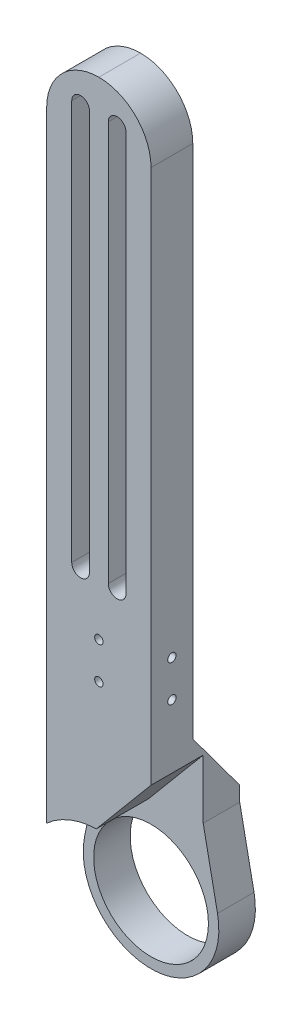
ISO-10303-21;
HEADER;
FILE_DESCRIPTION(('STEP AP214'),'2;1');
FILE_NAME('part.step','',(''),(''),'','','');
FILE_SCHEMA(('AUTOMOTIVE_DESIGN { 1 0 10303 214 1 1 1 1 }'));
ENDSEC;
DATA;
#1=APPLICATION_CONTEXT('core data for automotive mechanical design processes');
#2=APPLICATION_PROTOCOL_DEFINITION('international standard','automotive_design',2000,#1);
#3=PRODUCT_CONTEXT('',#1,'mechanical');
#4=PRODUCT('Part','Part','',(#3));
#5=PRODUCT_RELATED_PRODUCT_CATEGORY('part','',(#4));
#6=PRODUCT_DEFINITION_FORMATION('','',#4);
#7=PRODUCT_DEFINITION_CONTEXT('part definition',#1,'design');
#8=PRODUCT_DEFINITION('design','',#6,#7);
#9=PRODUCT_DEFINITION_SHAPE('','',#8);
#10=(LENGTH_UNIT() NAMED_UNIT(*) SI_UNIT(.MILLI.,.METRE.));
#11=(NAMED_UNIT(*) PLANE_ANGLE_UNIT() SI_UNIT($,.RADIAN.));
#12=(NAMED_UNIT(*) SI_UNIT($,.STERADIAN.) SOLID_ANGLE_UNIT());
#13=UNCERTAINTY_MEASURE_WITH_UNIT(LENGTH_MEASURE(1.E-05),#10,'distance_accuracy_value','');
#14=(GEOMETRIC_REPRESENTATION_CONTEXT(3) GLOBAL_UNCERTAINTY_ASSIGNED_CONTEXT((#13)) GLOBAL_UNIT_ASSIGNED_CONTEXT((#10,
#11,#12)) REPRESENTATION_CONTEXT('',''));
#15=CARTESIAN_POINT('',(0.,0.,0.));
#16=DIRECTION('',(0.,0.,1.));
#17=DIRECTION('',(1.,0.,0.));
#18=AXIS2_PLACEMENT_3D('',#15,#16,#17);
#19=CARTESIAN_POINT('',(9.99999999999999,0.,8.));
#20=DIRECTION('',(1.,0.,0.));
#21=DIRECTION('',(0.,1.,0.));
#22=AXIS2_PLACEMENT_3D('',#19,#20,#21);
#23=PLANE('',#22);
#24=CARTESIAN_POINT('',(9.99999999999999,-23.34,4.));
#25=DIRECTION('',(1.,0.,0.));
#26=DIRECTION('',(0.,0.,-1.));
#27=AXIS2_PLACEMENT_3D('',#24,#25,#26);
#28=CIRCLE('',#27,0.799999999999988);
#29=CARTESIAN_POINT('',(9.99999999999999,-23.34,3.20000000000001));
#30=VERTEX_POINT('',#29);
#31=EDGE_CURVE('E262',#30,#30,#28,.T.);
#32=ORIENTED_EDGE('',*,*,#31,.F.);
#33=EDGE_LOOP('',(#32));
#34=FACE_BOUND('',#33,.T.);
#35=CARTESIAN_POINT('',(9.99999999999999,-30.34,4.));
#36=DIRECTION('',(1.,0.,0.));
#37=DIRECTION('',(0.,0.,-1.));
#38=AXIS2_PLACEMENT_3D('',#35,#36,#37);
#39=CIRCLE('',#38,0.799999999999988);
#40=CARTESIAN_POINT('',(9.99999999999999,-30.34,3.20000000000001));
#41=VERTEX_POINT('',#40);
#42=EDGE_CURVE('E273',#41,#41,#39,.T.);
#43=ORIENTED_EDGE('',*,*,#42,.F.);
#44=EDGE_LOOP('',(#43));
#45=FACE_BOUND('',#44,.T.);
#46=DIRECTION('',(0.,0.,1.));
#47=VECTOR('',#46,1.);
#48=CARTESIAN_POINT('',(10.,-42.5252258054539,-21.370346995577));
#49=LINE('',#48,#47);
#50=CARTESIAN_POINT('',(10.,-42.5252258054539,-2.));
#51=VERTEX_POINT('',#50);
#52=CARTESIAN_POINT('',(10.,-42.5252258054539,8.));
#53=VERTEX_POINT('',#52);
#54=EDGE_CURVE('E90',#51,#53,#49,.T.);
#55=ORIENTED_EDGE('',*,*,#54,.F.);
#56=DIRECTION('',(0.,-1.,0.));
#57=VECTOR('',#56,1.);
#58=CARTESIAN_POINT('',(9.99999999999999,0.,-2.));
#59=LINE('',#58,#57);
#60=CARTESIAN_POINT('',(10.,-53.8445055785966,-2.));
#61=VERTEX_POINT('',#60);
#62=EDGE_CURVE('E476',#51,#61,#59,.T.);
#63=ORIENTED_EDGE('',*,*,#62,.T.);
#64=DIRECTION('',(0.,0.,1.));
#65=VECTOR('',#64,1.);
#66=CARTESIAN_POINT('',(10.,-53.8445055785966,-39.3208061909082));
#67=LINE('',#66,#65);
#68=CARTESIAN_POINT('',(10.,-53.8445055785966,-9.));
#69=VERTEX_POINT('',#68);
#70=EDGE_CURVE('E431',#69,#61,#67,.T.);
#71=ORIENTED_EDGE('',*,*,#70,.F.);
#72=DIRECTION('',(0.,1.,0.));
#73=VECTOR('',#72,1.);
#74=CARTESIAN_POINT('',(10.,-53.8445055785965,-9.));
#75=LINE('',#74,#73);
#76=CARTESIAN_POINT('',(10.,-51.0000000000001,-9.));
#77=VERTEX_POINT('',#76);
#78=EDGE_CURVE('E479',#69,#77,#75,.T.);
#79=ORIENTED_EDGE('',*,*,#78,.T.);
#80=DIRECTION('',(0.,0.803685881428132,0.595053782437425));
#81=VECTOR('',#80,1.);
#82=CARTESIAN_POINT('',(10.,-51.0000000000001,-9.));
#83=LINE('',#82,#81);
#84=CARTESIAN_POINT('',(10.,-38.8445055785965,0.));
#85=VERTEX_POINT('',#84);
#86=EDGE_CURVE('E484',#77,#85,#83,.T.);
#87=ORIENTED_EDGE('',*,*,#86,.T.);
#88=DIRECTION('',(0.,-1.,0.));
#89=VECTOR('',#88,1.);
#90=CARTESIAN_POINT('',(9.99999999999999,0.,0.));
#91=LINE('',#90,#89);
#92=CARTESIAN_POINT('',(9.99999999999998,60.,0.));
#93=VERTEX_POINT('',#92);
#94=EDGE_CURVE('E93',#93,#85,#91,.T.);
#95=ORIENTED_EDGE('',*,*,#94,.F.);
#96=DIRECTION('',(0.,0.,-1.));
#97=VECTOR('',#96,1.);
#98=CARTESIAN_POINT('',(9.99999999999998,60.,8.));
#99=LINE('',#98,#97);
#100=CARTESIAN_POINT('',(9.99999999999998,60.,8.));
#101=VERTEX_POINT('',#100);
#102=EDGE_CURVE('E417',#93,#101,#99,.F.);
#103=ORIENTED_EDGE('',*,*,#102,.T.);
#104=DIRECTION('',(0.,-1.,0.));
#105=VECTOR('',#104,1.);
#106=CARTESIAN_POINT('',(9.99999999999999,0.,8.));
#107=LINE('',#106,#105);
#108=EDGE_CURVE('E340',#101,#53,#107,.T.);
#109=ORIENTED_EDGE('',*,*,#108,.T.);
#110=EDGE_LOOP('',(#55,#63,#71,#79,#87,#95,#103,#109));
#111=FACE_BOUND('',#110,.T.);
#112=ADVANCED_FACE('F71',(#34,#45,#111),#23,.T.);
#113=CARTESIAN_POINT('',(0.,0.,8.));
#114=DIRECTION('',(0.,0.,1.));
#115=DIRECTION('',(1.,0.,0.));
#116=AXIS2_PLACEMENT_3D('',#113,#114,#115);
#117=PLANE('',#116);
#118=CARTESIAN_POINT('',(0.,-23.34,8.));
#119=DIRECTION('',(0.,0.,1.));
#120=DIRECTION('',(1.,0.,0.));
#121=AXIS2_PLACEMENT_3D('',#118,#119,#120);
#122=CIRCLE('',#121,0.799999999999999);
#123=CARTESIAN_POINT('',(0.800000000000007,-23.34,8.));
#124=VERTEX_POINT('',#123);
#125=EDGE_CURVE('E300',#124,#124,#122,.T.);
#126=ORIENTED_EDGE('',*,*,#125,.F.);
#127=EDGE_LOOP('',(#126));
#128=FACE_BOUND('',#127,.T.);
#129=CARTESIAN_POINT('',(0.,-30.34,8.));
#130=DIRECTION('',(0.,0.,1.));
#131=DIRECTION('',(1.,0.,0.));
#132=AXIS2_PLACEMENT_3D('',#129,#130,#131);
#133=CIRCLE('',#132,0.799999999999999);
#134=CARTESIAN_POINT('',(0.800000000000009,-30.34,8.));
#135=VERTEX_POINT('',#134);
#136=EDGE_CURVE('E304',#135,#135,#133,.T.);
#137=ORIENTED_EDGE('',*,*,#136,.F.);
#138=EDGE_LOOP('',(#137));
#139=FACE_BOUND('',#138,.T.);
#140=CARTESIAN_POINT('',(3.49999999999997,63.5,8.));
#141=DIRECTION('',(0.,0.,1.));
#142=DIRECTION('',(1.,0.,0.));
#143=AXIS2_PLACEMENT_3D('',#140,#141,#142);
#144=CIRCLE('',#143,1.70000000000002);
#145=CARTESIAN_POINT('',(5.2,63.5,8.));
#146=VERTEX_POINT('',#145);
#147=CARTESIAN_POINT('',(1.79999999999997,63.5,8.));
#148=VERTEX_POINT('',#147);
#149=EDGE_CURVE('E307',#146,#148,#144,.T.);
#150=ORIENTED_EDGE('',*,*,#149,.F.);
#151=DIRECTION('',(0.,1.,0.));
#152=VECTOR('',#151,1.);
#153=CARTESIAN_POINT('',(5.20000000000002,0.,8.));
#154=LINE('',#153,#152);
#155=CARTESIAN_POINT('',(5.20000000000002,-13.14,8.));
#156=VERTEX_POINT('',#155);
#157=EDGE_CURVE('E308',#156,#146,#154,.T.);
#158=ORIENTED_EDGE('',*,*,#157,.F.);
#159=CARTESIAN_POINT('',(3.5,-13.14,8.));
#160=DIRECTION('',(0.,0.,1.));
#161=DIRECTION('',(1.,0.,0.));
#162=AXIS2_PLACEMENT_3D('',#159,#160,#161);
#163=CIRCLE('',#162,1.70000000000001);
#164=CARTESIAN_POINT('',(1.8,-13.14,8.));
#165=VERTEX_POINT('',#164);
#166=EDGE_CURVE('E314',#165,#156,#163,.T.);
#167=ORIENTED_EDGE('',*,*,#166,.F.);
#168=DIRECTION('',(0.,1.,0.));
#169=VECTOR('',#168,1.);
#170=CARTESIAN_POINT('',(1.79999999999999,0.,8.));
#171=LINE('',#170,#169);
#172=EDGE_CURVE('E316',#165,#148,#171,.T.);
#173=ORIENTED_EDGE('',*,*,#172,.T.);
#174=EDGE_LOOP('',(#150,#158,#167,#173));
#175=FACE_BOUND('',#174,.T.);
#176=CARTESIAN_POINT('',(-3.50000000000003,63.5,8.));
#177=DIRECTION('',(0.,0.,1.));
#178=DIRECTION('',(1.,0.,0.));
#179=AXIS2_PLACEMENT_3D('',#176,#177,#178);
#180=CIRCLE('',#179,1.70000000000002);
#181=CARTESIAN_POINT('',(-1.80000000000001,63.5,8.));
#182=VERTEX_POINT('',#181);
#183=CARTESIAN_POINT('',(-5.20000000000005,63.5,8.));
#184=VERTEX_POINT('',#183);
#185=EDGE_CURVE('E325',#182,#184,#180,.T.);
#186=ORIENTED_EDGE('',*,*,#185,.F.);
#187=DIRECTION('',(0.,1.,0.));
#188=VECTOR('',#187,1.);
#189=CARTESIAN_POINT('',(-1.79999999999999,0.,8.));
#190=LINE('',#189,#188);
#191=CARTESIAN_POINT('',(-1.79999999999998,-13.14,8.));
#192=VERTEX_POINT('',#191);
#193=EDGE_CURVE('E329',#192,#182,#190,.T.);
#194=ORIENTED_EDGE('',*,*,#193,.F.);
#195=CARTESIAN_POINT('',(-3.5,-13.14,8.));
#196=DIRECTION('',(0.,0.,1.));
#197=DIRECTION('',(1.,0.,0.));
#198=AXIS2_PLACEMENT_3D('',#195,#196,#197);
#199=CIRCLE('',#198,1.70000000000001);
#200=CARTESIAN_POINT('',(-5.20000000000001,-13.14,8.));
#201=VERTEX_POINT('',#200);
#202=EDGE_CURVE('E327',#201,#192,#199,.T.);
#203=ORIENTED_EDGE('',*,*,#202,.F.);
#204=DIRECTION('',(0.,1.,0.));
#205=VECTOR('',#204,1.);
#206=CARTESIAN_POINT('',(-5.20000000000002,0.,8.));
#207=LINE('',#206,#205);
#208=EDGE_CURVE('E335',#201,#184,#207,.T.);
#209=ORIENTED_EDGE('',*,*,#208,.T.);
#210=EDGE_LOOP('',(#186,#194,#203,#209));
#211=FACE_BOUND('',#210,.T.);
#212=CARTESIAN_POINT('',(0.,-70.,8.));
#213=DIRECTION('',(0.,0.,1.));
#214=DIRECTION('',(1.,0.,0.));
#215=AXIS2_PLACEMENT_3D('',#212,#213,#214);
#216=CIRCLE('',#215,15.);
#217=CARTESIAN_POINT('',(-0.473860479421247,-55.0074866601346,8.));
#218=VERTEX_POINT('',#217);
#219=CARTESIAN_POINT('',(-9.99999999999999,-58.8196601125011,8.));
#220=VERTEX_POINT('',#219);
#221=EDGE_CURVE('E231',#218,#220,#216,.T.);
#222=ORIENTED_EDGE('',*,*,#221,.F.);
#223=DIRECTION('',(0.64278760968654,0.766044443118977,0.));
#224=VECTOR('',#223,1.);
#225=CARTESIAN_POINT('',(26.8078269242375,-22.4944376847921,8.));
#226=LINE('',#225,#224);
#227=EDGE_CURVE('E216',#218,#53,#226,.T.);
#228=ORIENTED_EDGE('',*,*,#227,.T.);
#229=ORIENTED_EDGE('',*,*,#108,.F.);
#230=CARTESIAN_POINT('',(0.,60.,8.));
#231=DIRECTION('',(0.,0.,1.));
#232=DIRECTION('',(1.,0.,0.));
#233=AXIS2_PLACEMENT_3D('',#230,#231,#232);
#234=CIRCLE('',#233,10.);
#235=CARTESIAN_POINT('',(0.,70.,8.));
#236=VERTEX_POINT('',#235);
#237=EDGE_CURVE('E411',#101,#236,#234,.T.);
#238=ORIENTED_EDGE('',*,*,#237,.T.);
#239=CARTESIAN_POINT('',(0.,60.,8.));
#240=DIRECTION('',(0.,0.,1.));
#241=DIRECTION('',(1.,0.,0.));
#242=AXIS2_PLACEMENT_3D('',#239,#240,#241);
#243=CIRCLE('',#242,10.);
#244=CARTESIAN_POINT('',(-10.,60.,8.));
#245=VERTEX_POINT('',#244);
#246=EDGE_CURVE('E416',#236,#245,#243,.T.);
#247=ORIENTED_EDGE('',*,*,#246,.T.);
#248=DIRECTION('',(0.,-1.,0.));
#249=VECTOR('',#248,1.);
#250=CARTESIAN_POINT('',(-9.99999999999999,0.,8.));
#251=LINE('',#250,#249);
#252=EDGE_CURVE('E242',#245,#220,#251,.T.);
#253=ORIENTED_EDGE('',*,*,#252,.T.);
#254=EDGE_LOOP('',(#222,#228,#229,#238,#247,#253));
#255=FACE_BOUND('',#254,.T.);
#256=ADVANCED_FACE('F238',(#128,#139,#175,#211,#255),#117,.T.);
#257=CARTESIAN_POINT('',(0.,-70.,50.4264068711929));
#258=DIRECTION('',(0.,0.,-1.));
#259=DIRECTION('',(-1.,0.,0.));
#260=AXIS2_PLACEMENT_3D('',#257,#258,#259);
#261=CYLINDRICAL_SURFACE('',#260,15.);
#262=CARTESIAN_POINT('',(0.,-70.,-2.));
#263=DIRECTION('',(0.,0.,1.));
#264=DIRECTION('',(1.,0.,0.));
#265=AXIS2_PLACEMENT_3D('',#262,#263,#264);
#266=CIRCLE('',#265,15.);
#267=CARTESIAN_POINT('',(-0.473860479421247,-55.0074866601346,-2.));
#268=VERTEX_POINT('',#267);
#269=CARTESIAN_POINT('',(-9.99999999999999,-58.8196601125011,-2.));
#270=VERTEX_POINT('',#269);
#271=EDGE_CURVE('E233',#268,#270,#266,.T.);
#272=ORIENTED_EDGE('',*,*,#271,.F.);
#273=DIRECTION('',(0.,0.,1.));
#274=VECTOR('',#273,1.);
#275=CARTESIAN_POINT('',(-0.473860479421247,-55.0074866601346,-21.370346995577));
#276=LINE('',#275,#274);
#277=EDGE_CURVE('E225',#268,#218,#276,.T.);
#278=ORIENTED_EDGE('',*,*,#277,.T.);
#279=ORIENTED_EDGE('',*,*,#221,.T.);
#280=DIRECTION('',(0.,0.,-1.));
#281=VECTOR('',#280,1.);
#282=CARTESIAN_POINT('',(-9.99999999999999,-58.8196601125011,50.4264068711929));
#283=LINE('',#282,#281);
#284=EDGE_CURVE('E244',#220,#270,#283,.T.);
#285=ORIENTED_EDGE('',*,*,#284,.T.);
#286=EDGE_LOOP('',(#272,#278,#279,#285));
#287=FACE_BOUND('',#286,.T.);
#288=ADVANCED_FACE('F232',(#287),#261,.F.);
#289=CARTESIAN_POINT('',(0.839061186172903,-0.169438737034393,-39.3208061909082));
#290=DIRECTION('',(-0.98021356585632,0.197942833442481,0.));
#291=DIRECTION('',(-0.197942833442481,-0.98021356585632,0.));
#292=AXIS2_PLACEMENT_3D('',#289,#290,#291);
#293=PLANE('',#292);
#294=DIRECTION('',(0.197942833442481,0.98021356585632,0.));
#295=VECTOR('',#294,1.);
#296=CARTESIAN_POINT('',(0.839061186172903,-0.169438737034393,-2.));
#297=LINE('',#296,#295);
#298=CARTESIAN_POINT('',(-12.7427763561322,-67.4267431652478,-2.));
#299=VERTEX_POINT('',#298);
#300=CARTESIAN_POINT('',(-9.99999999999999,-53.8445055785965,-2.));
#301=VERTEX_POINT('',#300);
#302=EDGE_CURVE('E12',#299,#301,#297,.T.);
#303=ORIENTED_EDGE('',*,*,#302,.T.);
#304=DIRECTION('',(0.,0.,1.));
#305=VECTOR('',#304,1.);
#306=CARTESIAN_POINT('',(-9.99999999999998,-53.8445055785965,-39.3208061909082));
#307=LINE('',#306,#305);
#308=CARTESIAN_POINT('',(-9.99999999999996,-53.8445055785965,-9.));
#309=VERTEX_POINT('',#308);
#310=EDGE_CURVE('E437',#309,#301,#307,.T.);
#311=ORIENTED_EDGE('',*,*,#310,.F.);
#312=DIRECTION('',(0.197942833442481,0.98021356585632,0.));
#313=VECTOR('',#312,1.);
#314=CARTESIAN_POINT('',(0.839061186172903,-0.169438737034393,-9.));
#315=LINE('',#314,#313);
#316=CARTESIAN_POINT('',(-12.7427763561322,-67.4267431652478,-9.));
#317=VERTEX_POINT('',#316);
#318=EDGE_CURVE('E426',#317,#309,#315,.T.);
#319=ORIENTED_EDGE('',*,*,#318,.F.);
#320=DIRECTION('',(0.,0.,1.));
#321=VECTOR('',#320,1.);
#322=CARTESIAN_POINT('',(-12.7427763561322,-67.4267431652478,-39.3208061909082));
#323=LINE('',#322,#321);
#324=EDGE_CURVE('E445',#317,#299,#323,.T.);
#325=ORIENTED_EDGE('',*,*,#324,.T.);
#326=EDGE_LOOP('',(#303,#311,#319,#325));
#327=FACE_BOUND('',#326,.T.);
#328=ADVANCED_FACE('F530',(#327),#293,.T.);
#329=CARTESIAN_POINT('',(-0.839061186172888,-0.16943873703439,-39.3208061909082));
#330=DIRECTION('',(-0.98021356585632,-0.197942833442481,0.));
#331=DIRECTION('',(0.197942833442481,-0.98021356585632,0.));
#332=AXIS2_PLACEMENT_3D('',#329,#330,#331);
#333=PLANE('',#332);
#334=ORIENTED_EDGE('',*,*,#70,.T.);
#335=DIRECTION('',(-0.197942833442481,0.98021356585632,0.));
#336=VECTOR('',#335,1.);
#337=CARTESIAN_POINT('',(-0.839061186172888,-0.16943873703439,-2.));
#338=LINE('',#337,#336);
#339=CARTESIAN_POINT('',(12.7427763561322,-67.4267431652478,-2.));
#340=VERTEX_POINT('',#339);
#341=EDGE_CURVE('E250',#340,#61,#338,.T.);
#342=ORIENTED_EDGE('',*,*,#341,.F.);
#343=DIRECTION('',(0.,0.,1.));
#344=VECTOR('',#343,1.);
#345=CARTESIAN_POINT('',(12.7427763561322,-67.4267431652478,-39.3208061909082));
#346=LINE('',#345,#344);
#347=CARTESIAN_POINT('',(12.7427763561322,-67.4267431652478,-9.));
#348=VERTEX_POINT('',#347);
#349=EDGE_CURVE('E425',#348,#340,#346,.T.);
#350=ORIENTED_EDGE('',*,*,#349,.F.);
#351=DIRECTION('',(-0.197942833442481,0.98021356585632,0.));
#352=VECTOR('',#351,1.);
#353=CARTESIAN_POINT('',(-0.839061186172888,-0.16943873703439,-9.));
#354=LINE('',#353,#352);
#355=EDGE_CURVE('E429',#348,#69,#354,.T.);
#356=ORIENTED_EDGE('',*,*,#355,.T.);
#357=EDGE_LOOP('',(#334,#342,#350,#356));
#358=FACE_BOUND('',#357,.T.);
#359=ADVANCED_FACE('F468',(#358),#333,.F.);
#360=CARTESIAN_POINT('',(-9.99999999999999,0.,8.));
#361=DIRECTION('',(1.,0.,0.));
#362=DIRECTION('',(0.,1.,0.));
#363=AXIS2_PLACEMENT_3D('',#360,#361,#362);
#364=PLANE('',#363);
#365=DIRECTION('',(0.,-1.,0.));
#366=VECTOR('',#365,1.);
#367=CARTESIAN_POINT('',(-9.99999999999999,0.,0.));
#368=LINE('',#367,#366);
#369=CARTESIAN_POINT('',(-10.,60.,0.));
#370=VERTEX_POINT('',#369);
#371=CARTESIAN_POINT('',(-9.99999999999999,-38.8445055785965,0.));
#372=VERTEX_POINT('',#371);
#373=EDGE_CURVE('E311',#370,#372,#368,.T.);
#374=ORIENTED_EDGE('',*,*,#373,.T.);
#375=DIRECTION('',(0.,-0.803685881428132,-0.595053782437425));
#376=VECTOR('',#375,1.);
#377=CARTESIAN_POINT('',(-9.99999999999999,-51.0000000000001,-9.));
#378=LINE('',#377,#376);
#379=CARTESIAN_POINT('',(-9.99999999999999,-51.0000000000001,-9.));
#380=VERTEX_POINT('',#379);
#381=EDGE_CURVE('E492',#372,#380,#378,.T.);
#382=ORIENTED_EDGE('',*,*,#381,.T.);
#383=DIRECTION('',(0.,-1.,0.));
#384=VECTOR('',#383,1.);
#385=CARTESIAN_POINT('',(-9.99999999999999,-53.8445055785965,-9.));
#386=LINE('',#385,#384);
#387=EDGE_CURVE('E497',#380,#309,#386,.T.);
#388=ORIENTED_EDGE('',*,*,#387,.T.);
#389=ORIENTED_EDGE('',*,*,#310,.T.);
#390=DIRECTION('',(0.,-1.,0.));
#391=VECTOR('',#390,1.);
#392=CARTESIAN_POINT('',(-9.99999999999999,-58.8196601125011,-2.));
#393=LINE('',#392,#391);
#394=EDGE_CURVE('E248',#301,#270,#393,.T.);
#395=ORIENTED_EDGE('',*,*,#394,.T.);
#396=ORIENTED_EDGE('',*,*,#284,.F.);
#397=ORIENTED_EDGE('',*,*,#252,.F.);
#398=DIRECTION('',(0.,0.,-1.));
#399=VECTOR('',#398,1.);
#400=CARTESIAN_POINT('',(-10.,60.,8.));
#401=LINE('',#400,#399);
#402=EDGE_CURVE('E394',#245,#370,#401,.T.);
#403=ORIENTED_EDGE('',*,*,#402,.T.);
#404=EDGE_LOOP('',(#374,#382,#388,#389,#395,#396,#397,#403));
#405=FACE_BOUND('',#404,.T.);
#406=CARTESIAN_POINT('',(-9.99999999999999,-30.34,4.));
#407=DIRECTION('',(-1.,0.,0.));
#408=DIRECTION('',(0.,0.,1.));
#409=AXIS2_PLACEMENT_3D('',#406,#407,#408);
#410=CIRCLE('',#409,0.799999999999988);
#411=CARTESIAN_POINT('',(-9.99999999999999,-30.34,4.79999999999999));
#412=VERTEX_POINT('',#411);
#413=EDGE_CURVE('E288',#412,#412,#410,.T.);
#414=ORIENTED_EDGE('',*,*,#413,.F.);
#415=EDGE_LOOP('',(#414));
#416=FACE_BOUND('',#415,.T.);
#417=CARTESIAN_POINT('',(-9.99999999999999,-23.34,4.));
#418=DIRECTION('',(-1.,0.,0.));
#419=DIRECTION('',(0.,0.,1.));
#420=AXIS2_PLACEMENT_3D('',#417,#418,#419);
#421=CIRCLE('',#420,0.799999999999988);
#422=CARTESIAN_POINT('',(-9.99999999999999,-23.34,4.79999999999999));
#423=VERTEX_POINT('',#422);
#424=EDGE_CURVE('E282',#423,#423,#421,.T.);
#425=ORIENTED_EDGE('',*,*,#424,.F.);
#426=EDGE_LOOP('',(#425));
#427=FACE_BOUND('',#426,.T.);
#428=ADVANCED_FACE('F521',(#405,#416,#427),#364,.F.);
#429=CARTESIAN_POINT('',(0.,-70.,-9.));
#430=DIRECTION('',(0.,0.,1.));
#431=DIRECTION('',(1.,0.,0.));
#432=AXIS2_PLACEMENT_3D('',#429,#430,#431);
#433=CYLINDRICAL_SURFACE('',#432,13.);
#434=ORIENTED_EDGE('',*,*,#324,.F.);
#435=CARTESIAN_POINT('',(0.,-70.,-9.));
#436=DIRECTION('',(0.,0.,1.));
#437=DIRECTION('',(1.,0.,0.));
#438=AXIS2_PLACEMENT_3D('',#435,#436,#437);
#439=CIRCLE('',#438,13.);
#440=EDGE_CURVE('E77',#317,#348,#439,.T.);
#441=ORIENTED_EDGE('',*,*,#440,.T.);
#442=ORIENTED_EDGE('',*,*,#349,.T.);
#443=CARTESIAN_POINT('',(0.,-70.,-2.));
#444=DIRECTION('',(0.,0.,1.));
#445=DIRECTION('',(1.,0.,0.));
#446=AXIS2_PLACEMENT_3D('',#443,#444,#445);
#447=CIRCLE('',#446,13.);
#448=EDGE_CURVE('E451',#299,#340,#447,.T.);
#449=ORIENTED_EDGE('',*,*,#448,.F.);
#450=EDGE_LOOP('',(#434,#441,#442,#449));
#451=FACE_BOUND('',#450,.T.);
#452=ADVANCED_FACE('F72',(#451),#433,.T.);
#453=CARTESIAN_POINT('',(0.,-70.,-9.));
#454=DIRECTION('',(0.,0.,1.));
#455=DIRECTION('',(1.,0.,0.));
#456=AXIS2_PLACEMENT_3D('',#453,#454,#455);
#457=PLANE('',#456);
#458=ORIENTED_EDGE('',*,*,#387,.F.);
#459=DIRECTION('',(-1.,0.,0.));
#460=VECTOR('',#459,1.);
#461=CARTESIAN_POINT('',(27.4928556845359,-51.0000000000001,-9.));
#462=LINE('',#461,#460);
#463=EDGE_CURVE('E481',#77,#380,#462,.T.);
#464=ORIENTED_EDGE('',*,*,#463,.F.);
#465=ORIENTED_EDGE('',*,*,#78,.F.);
#466=ORIENTED_EDGE('',*,*,#355,.F.);
#467=ORIENTED_EDGE('',*,*,#440,.F.);
#468=ORIENTED_EDGE('',*,*,#318,.T.);
#469=EDGE_LOOP('',(#458,#464,#465,#466,#467,#468));
#470=FACE_BOUND('',#469,.T.);
#471=CARTESIAN_POINT('',(0.,-70.,-9.));
#472=DIRECTION('',(0.,0.,1.));
#473=DIRECTION('',(1.,0.,0.));
#474=AXIS2_PLACEMENT_3D('',#471,#472,#473);
#475=CIRCLE('',#474,11.);
#476=CARTESIAN_POINT('',(11.,-70.,-9.));
#477=VERTEX_POINT('',#476);
#478=EDGE_CURVE('E447',#477,#477,#475,.T.);
#479=ORIENTED_EDGE('',*,*,#478,.T.);
#480=EDGE_LOOP('',(#479));
#481=FACE_BOUND('',#480,.T.);
#482=ADVANCED_FACE('F483',(#470,#481),#457,.F.);
#483=CARTESIAN_POINT('',(0.,-70.,-2.));
#484=DIRECTION('',(0.,0.,1.));
#485=DIRECTION('',(1.,0.,0.));
#486=AXIS2_PLACEMENT_3D('',#483,#484,#485);
#487=PLANE('',#486);
#488=DIRECTION('',(-0.64278760968654,-0.766044443118977,0.));
#489=VECTOR('',#488,1.);
#490=CARTESIAN_POINT('',(26.8078269242375,-22.4944376847921,-2.));
#491=LINE('',#490,#489);
#492=EDGE_CURVE('E502',#51,#268,#491,.T.);
#493=ORIENTED_EDGE('',*,*,#492,.T.);
#494=ORIENTED_EDGE('',*,*,#271,.T.);
#495=ORIENTED_EDGE('',*,*,#394,.F.);
#496=ORIENTED_EDGE('',*,*,#302,.F.);
#497=ORIENTED_EDGE('',*,*,#448,.T.);
#498=ORIENTED_EDGE('',*,*,#341,.T.);
#499=ORIENTED_EDGE('',*,*,#62,.F.);
#500=EDGE_LOOP('',(#493,#494,#495,#496,#497,#498,#499));
#501=FACE_BOUND('',#500,.T.);
#502=CARTESIAN_POINT('',(0.,-70.,-2.));
#503=DIRECTION('',(0.,0.,1.));
#504=DIRECTION('',(1.,0.,0.));
#505=AXIS2_PLACEMENT_3D('',#502,#503,#504);
#506=CIRCLE('',#505,11.);
#507=CARTESIAN_POINT('',(11.,-70.,-2.));
#508=VERTEX_POINT('',#507);
#509=EDGE_CURVE('E428',#508,#508,#506,.T.);
#510=ORIENTED_EDGE('',*,*,#509,.F.);
#511=EDGE_LOOP('',(#510));
#512=FACE_BOUND('',#511,.T.);
#513=ADVANCED_FACE('F465',(#501,#512),#487,.T.);
#514=CARTESIAN_POINT('',(0.,-70.,-9.));
#515=DIRECTION('',(0.,0.,1.));
#516=DIRECTION('',(1.,0.,0.));
#517=AXIS2_PLACEMENT_3D('',#514,#515,#516);
#518=CYLINDRICAL_SURFACE('',#517,11.);
#519=ORIENTED_EDGE('',*,*,#478,.F.);
#520=EDGE_LOOP('',(#519));
#521=FACE_BOUND('',#520,.T.);
#522=ORIENTED_EDGE('',*,*,#509,.T.);
#523=EDGE_LOOP('',(#522));
#524=FACE_BOUND('',#523,.T.);
#525=ADVANCED_FACE('F735',(#521,#524),#518,.F.);
#526=CARTESIAN_POINT('',(0.,0.,0.));
#527=DIRECTION('',(0.,0.,1.));
#528=DIRECTION('',(1.,0.,0.));
#529=AXIS2_PLACEMENT_3D('',#526,#527,#528);
#530=PLANE('',#529);
#531=ORIENTED_EDGE('',*,*,#94,.T.);
#532=DIRECTION('',(-1.,0.,0.));
#533=VECTOR('',#532,1.);
#534=CARTESIAN_POINT('',(27.4928556845359,-38.8445055785966,0.));
#535=LINE('',#534,#533);
#536=EDGE_CURVE('E488',#85,#372,#535,.T.);
#537=ORIENTED_EDGE('',*,*,#536,.T.);
#538=ORIENTED_EDGE('',*,*,#373,.F.);
#539=CARTESIAN_POINT('',(0.,60.,0.));
#540=DIRECTION('',(0.,0.,1.));
#541=DIRECTION('',(1.,0.,0.));
#542=AXIS2_PLACEMENT_3D('',#539,#540,#541);
#543=CIRCLE('',#542,10.);
#544=CARTESIAN_POINT('',(0.,70.,0.));
#545=VERTEX_POINT('',#544);
#546=EDGE_CURVE('E409',#370,#545,#543,.F.);
#547=ORIENTED_EDGE('',*,*,#546,.T.);
#548=CARTESIAN_POINT('',(0.,60.,0.));
#549=DIRECTION('',(0.,0.,1.));
#550=DIRECTION('',(1.,0.,0.));
#551=AXIS2_PLACEMENT_3D('',#548,#549,#550);
#552=CIRCLE('',#551,10.);
#553=EDGE_CURVE('E407',#545,#93,#552,.F.);
#554=ORIENTED_EDGE('',*,*,#553,.T.);
#555=EDGE_LOOP('',(#531,#537,#538,#547,#554));
#556=FACE_BOUND('',#555,.T.);
#557=CARTESIAN_POINT('',(-3.50000000000003,63.5,0.));
#558=DIRECTION('',(0.,0.,1.));
#559=DIRECTION('',(1.,0.,0.));
#560=AXIS2_PLACEMENT_3D('',#557,#558,#559);
#561=CIRCLE('',#560,1.70000000000002);
#562=CARTESIAN_POINT('',(-1.80000000000001,63.5,0.));
#563=VERTEX_POINT('',#562);
#564=CARTESIAN_POINT('',(-5.20000000000005,63.5,0.));
#565=VERTEX_POINT('',#564);
#566=EDGE_CURVE('E356',#563,#565,#561,.T.);
#567=ORIENTED_EDGE('',*,*,#566,.T.);
#568=DIRECTION('',(0.,1.,0.));
#569=VECTOR('',#568,1.);
#570=CARTESIAN_POINT('',(-5.20000000000002,0.,0.));
#571=LINE('',#570,#569);
#572=CARTESIAN_POINT('',(-5.20000000000001,-13.14,0.));
#573=VERTEX_POINT('',#572);
#574=EDGE_CURVE('E371',#573,#565,#571,.T.);
#575=ORIENTED_EDGE('',*,*,#574,.F.);
#576=CARTESIAN_POINT('',(-3.5,-13.14,0.));
#577=DIRECTION('',(0.,0.,1.));
#578=DIRECTION('',(1.,0.,0.));
#579=AXIS2_PLACEMENT_3D('',#576,#577,#578);
#580=CIRCLE('',#579,1.70000000000001);
#581=CARTESIAN_POINT('',(-1.79999999999998,-13.14,0.));
#582=VERTEX_POINT('',#581);
#583=EDGE_CURVE('E370',#573,#582,#580,.T.);
#584=ORIENTED_EDGE('',*,*,#583,.T.);
#585=DIRECTION('',(0.,1.,0.));
#586=VECTOR('',#585,1.);
#587=CARTESIAN_POINT('',(-1.79999999999999,0.,0.));
#588=LINE('',#587,#586);
#589=EDGE_CURVE('E362',#582,#563,#588,.T.);
#590=ORIENTED_EDGE('',*,*,#589,.T.);
#591=EDGE_LOOP('',(#567,#575,#584,#590));
#592=FACE_BOUND('',#591,.T.);
#593=CARTESIAN_POINT('',(3.49999999999997,63.5,0.));
#594=DIRECTION('',(0.,0.,1.));
#595=DIRECTION('',(1.,0.,0.));
#596=AXIS2_PLACEMENT_3D('',#593,#594,#595);
#597=CIRCLE('',#596,1.70000000000002);
#598=CARTESIAN_POINT('',(5.2,63.5,0.));
#599=VERTEX_POINT('',#598);
#600=CARTESIAN_POINT('',(1.79999999999997,63.5,0.));
#601=VERTEX_POINT('',#600);
#602=EDGE_CURVE('E343',#599,#601,#597,.T.);
#603=ORIENTED_EDGE('',*,*,#602,.T.);
#604=DIRECTION('',(0.,1.,0.));
#605=VECTOR('',#604,1.);
#606=CARTESIAN_POINT('',(1.79999999999999,0.,0.));
#607=LINE('',#606,#605);
#608=CARTESIAN_POINT('',(1.8,-13.14,0.));
#609=VERTEX_POINT('',#608);
#610=EDGE_CURVE('E354',#609,#601,#607,.T.);
#611=ORIENTED_EDGE('',*,*,#610,.F.);
#612=CARTESIAN_POINT('',(3.5,-13.14,0.));
#613=DIRECTION('',(0.,0.,1.));
#614=DIRECTION('',(1.,0.,0.));
#615=AXIS2_PLACEMENT_3D('',#612,#613,#614);
#616=CIRCLE('',#615,1.70000000000001);
#617=CARTESIAN_POINT('',(5.20000000000002,-13.14,0.));
#618=VERTEX_POINT('',#617);
#619=EDGE_CURVE('E351',#609,#618,#616,.T.);
#620=ORIENTED_EDGE('',*,*,#619,.T.);
#621=DIRECTION('',(0.,1.,0.));
#622=VECTOR('',#621,1.);
#623=CARTESIAN_POINT('',(5.20000000000002,0.,0.));
#624=LINE('',#623,#622);
#625=EDGE_CURVE('E350',#618,#599,#624,.T.);
#626=ORIENTED_EDGE('',*,*,#625,.T.);
#627=EDGE_LOOP('',(#603,#611,#620,#626));
#628=FACE_BOUND('',#627,.T.);
#629=CARTESIAN_POINT('',(0.,-30.34,0.));
#630=DIRECTION('',(0.,0.,-1.));
#631=DIRECTION('',(-1.,0.,0.));
#632=AXIS2_PLACEMENT_3D('',#629,#630,#631);
#633=CIRCLE('',#632,0.799999999999999);
#634=CARTESIAN_POINT('',(-0.799999999999989,-30.34,0.));
#635=VERTEX_POINT('',#634);
#636=EDGE_CURVE('E263',#635,#635,#633,.T.);
#637=ORIENTED_EDGE('',*,*,#636,.F.);
#638=EDGE_LOOP('',(#637));
#639=FACE_BOUND('',#638,.T.);
#640=CARTESIAN_POINT('',(0.,-23.34,0.));
#641=DIRECTION('',(0.,0.,-1.));
#642=DIRECTION('',(-1.,0.,0.));
#643=AXIS2_PLACEMENT_3D('',#640,#641,#642);
#644=CIRCLE('',#643,0.799999999999999);
#645=CARTESIAN_POINT('',(-0.799999999999991,-23.34,0.));
#646=VERTEX_POINT('',#645);
#647=EDGE_CURVE('E257',#646,#646,#644,.T.);
#648=ORIENTED_EDGE('',*,*,#647,.F.);
#649=EDGE_LOOP('',(#648));
#650=FACE_BOUND('',#649,.T.);
#651=ADVANCED_FACE('F573',(#556,#592,#628,#639,#650),#530,.F.);
#652=CARTESIAN_POINT('',(-3.50000000000003,63.5,8.));
#653=DIRECTION('',(0.,0.,-1.));
#654=DIRECTION('',(-1.,0.,0.));
#655=AXIS2_PLACEMENT_3D('',#652,#653,#654);
#656=CYLINDRICAL_SURFACE('',#655,1.70000000000002);
#657=ORIENTED_EDGE('',*,*,#566,.F.);
#658=DIRECTION('',(0.,0.,-1.));
#659=VECTOR('',#658,1.);
#660=CARTESIAN_POINT('',(-1.80000000000001,63.5,8.));
#661=LINE('',#660,#659);
#662=EDGE_CURVE('E389',#182,#563,#661,.T.);
#663=ORIENTED_EDGE('',*,*,#662,.F.);
#664=ORIENTED_EDGE('',*,*,#185,.T.);
#665=DIRECTION('',(0.,0.,-1.));
#666=VECTOR('',#665,1.);
#667=CARTESIAN_POINT('',(-5.20000000000005,63.5,8.));
#668=LINE('',#667,#666);
#669=EDGE_CURVE('E377',#184,#565,#668,.T.);
#670=ORIENTED_EDGE('',*,*,#669,.T.);
#671=EDGE_LOOP('',(#657,#663,#664,#670));
#672=FACE_BOUND('',#671,.T.);
#673=ADVANCED_FACE('F567',(#672),#656,.F.);
#674=CARTESIAN_POINT('',(-1.79999999999999,0.,8.));
#675=DIRECTION('',(-1.,0.,0.));
#676=DIRECTION('',(0.,-1.,0.));
#677=AXIS2_PLACEMENT_3D('',#674,#675,#676);
#678=PLANE('',#677);
#679=ORIENTED_EDGE('',*,*,#589,.F.);
#680=DIRECTION('',(0.,0.,-1.));
#681=VECTOR('',#680,1.);
#682=CARTESIAN_POINT('',(-1.79999999999998,-13.14,8.));
#683=LINE('',#682,#681);
#684=EDGE_CURVE('E390',#192,#582,#683,.T.);
#685=ORIENTED_EDGE('',*,*,#684,.F.);
#686=ORIENTED_EDGE('',*,*,#193,.T.);
#687=ORIENTED_EDGE('',*,*,#662,.T.);
#688=EDGE_LOOP('',(#679,#685,#686,#687));
#689=FACE_BOUND('',#688,.T.);
#690=ADVANCED_FACE('F562',(#689),#678,.T.);
#691=CARTESIAN_POINT('',(-3.5,-13.14,8.));
#692=DIRECTION('',(0.,0.,-1.));
#693=DIRECTION('',(-1.,0.,0.));
#694=AXIS2_PLACEMENT_3D('',#691,#692,#693);
#695=CYLINDRICAL_SURFACE('',#694,1.70000000000001);
#696=ORIENTED_EDGE('',*,*,#583,.F.);
#697=DIRECTION('',(0.,0.,-1.));
#698=VECTOR('',#697,1.);
#699=CARTESIAN_POINT('',(-5.20000000000001,-13.14,8.));
#700=LINE('',#699,#698);
#701=EDGE_CURVE('E381',#201,#573,#700,.T.);
#702=ORIENTED_EDGE('',*,*,#701,.F.);
#703=ORIENTED_EDGE('',*,*,#202,.T.);
#704=ORIENTED_EDGE('',*,*,#684,.T.);
#705=EDGE_LOOP('',(#696,#702,#703,#704));
#706=FACE_BOUND('',#705,.T.);
#707=ADVANCED_FACE('F563',(#706),#695,.F.);
#708=CARTESIAN_POINT('',(3.49999999999997,63.5,8.));
#709=DIRECTION('',(0.,0.,-1.));
#710=DIRECTION('',(-1.,0.,0.));
#711=AXIS2_PLACEMENT_3D('',#708,#709,#710);
#712=CYLINDRICAL_SURFACE('',#711,1.70000000000002);
#713=ORIENTED_EDGE('',*,*,#602,.F.);
#714=DIRECTION('',(0.,0.,-1.));
#715=VECTOR('',#714,1.);
#716=CARTESIAN_POINT('',(5.2,63.5,8.));
#717=LINE('',#716,#715);
#718=EDGE_CURVE('E384',#146,#599,#717,.T.);
#719=ORIENTED_EDGE('',*,*,#718,.F.);
#720=ORIENTED_EDGE('',*,*,#149,.T.);
#721=DIRECTION('',(0.,0.,-1.));
#722=VECTOR('',#721,1.);
#723=CARTESIAN_POINT('',(1.79999999999997,63.5,8.));
#724=LINE('',#723,#722);
#725=EDGE_CURVE('E345',#148,#601,#724,.T.);
#726=ORIENTED_EDGE('',*,*,#725,.T.);
#727=EDGE_LOOP('',(#713,#719,#720,#726));
#728=FACE_BOUND('',#727,.T.);
#729=ADVANCED_FACE('F564',(#728),#712,.F.);
#730=CARTESIAN_POINT('',(5.20000000000002,0.,8.));
#731=DIRECTION('',(-1.,0.,0.));
#732=DIRECTION('',(0.,-1.,0.));
#733=AXIS2_PLACEMENT_3D('',#730,#731,#732);
#734=PLANE('',#733);
#735=ORIENTED_EDGE('',*,*,#625,.F.);
#736=DIRECTION('',(0.,0.,-1.));
#737=VECTOR('',#736,1.);
#738=CARTESIAN_POINT('',(5.20000000000002,-13.14,8.));
#739=LINE('',#738,#737);
#740=EDGE_CURVE('E398',#156,#618,#739,.T.);
#741=ORIENTED_EDGE('',*,*,#740,.F.);
#742=ORIENTED_EDGE('',*,*,#157,.T.);
#743=ORIENTED_EDGE('',*,*,#718,.T.);
#744=EDGE_LOOP('',(#735,#741,#742,#743));
#745=FACE_BOUND('',#744,.T.);
#746=ADVANCED_FACE('F579',(#745),#734,.T.);
#747=CARTESIAN_POINT('',(3.5,-13.14,8.));
#748=DIRECTION('',(0.,0.,-1.));
#749=DIRECTION('',(-1.,0.,0.));
#750=AXIS2_PLACEMENT_3D('',#747,#748,#749);
#751=CYLINDRICAL_SURFACE('',#750,1.70000000000001);
#752=ORIENTED_EDGE('',*,*,#619,.F.);
#753=DIRECTION('',(0.,0.,-1.));
#754=VECTOR('',#753,1.);
#755=CARTESIAN_POINT('',(1.8,-13.14,8.));
#756=LINE('',#755,#754);
#757=EDGE_CURVE('E396',#165,#609,#756,.T.);
#758=ORIENTED_EDGE('',*,*,#757,.F.);
#759=ORIENTED_EDGE('',*,*,#166,.T.);
#760=ORIENTED_EDGE('',*,*,#740,.T.);
#761=EDGE_LOOP('',(#752,#758,#759,#760));
#762=FACE_BOUND('',#761,.T.);
#763=ADVANCED_FACE('F560',(#762),#751,.F.);
#764=CARTESIAN_POINT('',(-5.20000000000002,0.,8.));
#765=DIRECTION('',(-1.,0.,0.));
#766=DIRECTION('',(0.,-1.,0.));
#767=AXIS2_PLACEMENT_3D('',#764,#765,#766);
#768=PLANE('',#767);
#769=ORIENTED_EDGE('',*,*,#574,.T.);
#770=ORIENTED_EDGE('',*,*,#669,.F.);
#771=ORIENTED_EDGE('',*,*,#208,.F.);
#772=ORIENTED_EDGE('',*,*,#701,.T.);
#773=EDGE_LOOP('',(#769,#770,#771,#772));
#774=FACE_BOUND('',#773,.T.);
#775=ADVANCED_FACE('F552',(#774),#768,.F.);
#776=CARTESIAN_POINT('',(1.79999999999999,0.,8.));
#777=DIRECTION('',(-1.,0.,0.));
#778=DIRECTION('',(0.,-1.,0.));
#779=AXIS2_PLACEMENT_3D('',#776,#777,#778);
#780=PLANE('',#779);
#781=ORIENTED_EDGE('',*,*,#610,.T.);
#782=ORIENTED_EDGE('',*,*,#725,.F.);
#783=ORIENTED_EDGE('',*,*,#172,.F.);
#784=ORIENTED_EDGE('',*,*,#757,.T.);
#785=EDGE_LOOP('',(#781,#782,#783,#784));
#786=FACE_BOUND('',#785,.T.);
#787=ADVANCED_FACE('F556',(#786),#780,.F.);
#788=CARTESIAN_POINT('',(0.,60.,8.));
#789=DIRECTION('',(0.,0.,1.));
#790=DIRECTION('',(1.,0.,0.));
#791=AXIS2_PLACEMENT_3D('',#788,#789,#790);
#792=CYLINDRICAL_SURFACE('',#791,10.);
#793=DIRECTION('',(0.,0.,-1.));
#794=VECTOR('',#793,1.);
#795=CARTESIAN_POINT('',(0.,70.,0.));
#796=LINE('',#795,#794);
#797=EDGE_CURVE('E302',#236,#545,#796,.T.);
#798=ORIENTED_EDGE('',*,*,#797,.F.);
#799=ORIENTED_EDGE('',*,*,#237,.F.);
#800=ORIENTED_EDGE('',*,*,#102,.F.);
#801=ORIENTED_EDGE('',*,*,#553,.F.);
#802=EDGE_LOOP('',(#798,#799,#800,#801));
#803=FACE_BOUND('',#802,.T.);
#804=ADVANCED_FACE('F514',(#803),#792,.T.);
#805=CARTESIAN_POINT('',(0.,60.,8.));
#806=DIRECTION('',(0.,0.,-1.));
#807=DIRECTION('',(-1.,0.,0.));
#808=AXIS2_PLACEMENT_3D('',#805,#806,#807);
#809=CYLINDRICAL_SURFACE('',#808,10.);
#810=ORIENTED_EDGE('',*,*,#246,.F.);
#811=ORIENTED_EDGE('',*,*,#797,.T.);
#812=ORIENTED_EDGE('',*,*,#546,.F.);
#813=ORIENTED_EDGE('',*,*,#402,.F.);
#814=EDGE_LOOP('',(#810,#811,#812,#813));
#815=FACE_BOUND('',#814,.T.);
#816=ADVANCED_FACE('F518',(#815),#809,.T.);
#817=CARTESIAN_POINT('',(0.,-30.34,8.));
#818=DIRECTION('',(0.,0.,1.));
#819=DIRECTION('',(1.,0.,0.));
#820=AXIS2_PLACEMENT_3D('',#817,#818,#819);
#821=CYLINDRICAL_SURFACE('',#820,0.799999999999999);
#822=ORIENTED_EDGE('',*,*,#136,.T.);
#823=EDGE_LOOP('',(#822));
#824=FACE_BOUND('',#823,.T.);
#825=ORIENTED_EDGE('',*,*,#636,.T.);
#826=EDGE_LOOP('',(#825));
#827=FACE_BOUND('',#826,.T.);
#828=ADVANCED_FACE('F589',(#824,#827),#821,.F.);
#829=CARTESIAN_POINT('',(0.,-23.34,8.));
#830=DIRECTION('',(0.,0.,1.));
#831=DIRECTION('',(1.,0.,0.));
#832=AXIS2_PLACEMENT_3D('',#829,#830,#831);
#833=CYLINDRICAL_SURFACE('',#832,0.799999999999999);
#834=ORIENTED_EDGE('',*,*,#125,.T.);
#835=EDGE_LOOP('',(#834));
#836=FACE_BOUND('',#835,.T.);
#837=ORIENTED_EDGE('',*,*,#647,.T.);
#838=EDGE_LOOP('',(#837));
#839=FACE_BOUND('',#838,.T.);
#840=ADVANCED_FACE('F606',(#836,#839),#833,.F.);
#841=CARTESIAN_POINT('',(-4.8,-30.34,4.));
#842=DIRECTION('',(-1.,0.,0.));
#843=DIRECTION('',(0.,0.,1.));
#844=AXIS2_PLACEMENT_3D('',#841,#842,#843);
#845=CONICAL_SURFACE('',#844,0.799999999999988,1.02974425867664);
#846=CARTESIAN_POINT('',(-4.31931150477794,-30.34,4.));
#847=VERTEX_POINT('',#846);
#848=VERTEX_LOOP('',#847);
#849=FACE_BOUND('',#848,.T.);
#850=CARTESIAN_POINT('',(-4.8,-30.34,4.));
#851=DIRECTION('',(-1.,0.,0.));
#852=DIRECTION('',(0.,0.,1.));
#853=AXIS2_PLACEMENT_3D('',#850,#851,#852);
#854=CIRCLE('',#853,0.799999999999988);
#855=CARTESIAN_POINT('',(-4.8,-30.34,4.79999999999999));
#856=VERTEX_POINT('',#855);
#857=EDGE_CURVE('E294',#856,#856,#854,.T.);
#858=ORIENTED_EDGE('',*,*,#857,.T.);
#859=EDGE_LOOP('',(#858));
#860=FACE_BOUND('',#859,.T.);
#861=ADVANCED_FACE('F621',(#849,#860),#845,.F.);
#862=CARTESIAN_POINT('',(-9.99999999999999,-30.34,4.));
#863=DIRECTION('',(-1.,0.,0.));
#864=DIRECTION('',(0.,0.,1.));
#865=AXIS2_PLACEMENT_3D('',#862,#863,#864);
#866=CYLINDRICAL_SURFACE('',#865,0.799999999999988);
#867=ORIENTED_EDGE('',*,*,#857,.F.);
#868=EDGE_LOOP('',(#867));
#869=FACE_BOUND('',#868,.T.);
#870=ORIENTED_EDGE('',*,*,#413,.T.);
#871=EDGE_LOOP('',(#870));
#872=FACE_BOUND('',#871,.T.);
#873=ADVANCED_FACE('F633',(#869,#872),#866,.F.);
#874=CARTESIAN_POINT('',(-4.8,-23.34,4.));
#875=DIRECTION('',(-1.,0.,0.));
#876=DIRECTION('',(0.,0.,1.));
#877=AXIS2_PLACEMENT_3D('',#874,#875,#876);
#878=CONICAL_SURFACE('',#877,0.799999999999988,1.02974425867664);
#879=CARTESIAN_POINT('',(-4.31931150477794,-23.34,4.));
#880=VERTEX_POINT('',#879);
#881=VERTEX_LOOP('',#880);
#882=FACE_BOUND('',#881,.T.);
#883=CARTESIAN_POINT('',(-4.8,-23.34,4.));
#884=DIRECTION('',(-1.,0.,0.));
#885=DIRECTION('',(0.,0.,1.));
#886=AXIS2_PLACEMENT_3D('',#883,#884,#885);
#887=CIRCLE('',#886,0.799999999999988);
#888=CARTESIAN_POINT('',(-4.8,-23.34,4.79999999999999));
#889=VERTEX_POINT('',#888);
#890=EDGE_CURVE('E283',#889,#889,#887,.T.);
#891=ORIENTED_EDGE('',*,*,#890,.T.);
#892=EDGE_LOOP('',(#891));
#893=FACE_BOUND('',#892,.T.);
#894=ADVANCED_FACE('F637',(#882,#893),#878,.F.);
#895=CARTESIAN_POINT('',(-9.99999999999999,-23.34,4.));
#896=DIRECTION('',(-1.,0.,0.));
#897=DIRECTION('',(0.,0.,1.));
#898=AXIS2_PLACEMENT_3D('',#895,#896,#897);
#899=CYLINDRICAL_SURFACE('',#898,0.799999999999988);
#900=ORIENTED_EDGE('',*,*,#890,.F.);
#901=EDGE_LOOP('',(#900));
#902=FACE_BOUND('',#901,.T.);
#903=ORIENTED_EDGE('',*,*,#424,.T.);
#904=EDGE_LOOP('',(#903));
#905=FACE_BOUND('',#904,.T.);
#906=ADVANCED_FACE('F649',(#902,#905),#899,.F.);
#907=CARTESIAN_POINT('',(4.8,-30.34,4.));
#908=DIRECTION('',(1.,0.,0.));
#909=DIRECTION('',(0.,0.,-1.));
#910=AXIS2_PLACEMENT_3D('',#907,#908,#909);
#911=CONICAL_SURFACE('',#910,0.799999999999988,1.02974425867664);
#912=CARTESIAN_POINT('',(4.31931150477794,-30.34,4.));
#913=VERTEX_POINT('',#912);
#914=VERTEX_LOOP('',#913);
#915=FACE_BOUND('',#914,.T.);
#916=CARTESIAN_POINT('',(4.8,-30.34,4.));
#917=DIRECTION('',(1.,0.,0.));
#918=DIRECTION('',(0.,0.,-1.));
#919=AXIS2_PLACEMENT_3D('',#916,#917,#918);
#920=CIRCLE('',#919,0.799999999999988);
#921=CARTESIAN_POINT('',(4.8,-30.34,3.20000000000001));
#922=VERTEX_POINT('',#921);
#923=EDGE_CURVE('E280',#922,#922,#920,.T.);
#924=ORIENTED_EDGE('',*,*,#923,.T.);
#925=EDGE_LOOP('',(#924));
#926=FACE_BOUND('',#925,.T.);
#927=ADVANCED_FACE('F658',(#915,#926),#911,.F.);
#928=CARTESIAN_POINT('',(9.99999999999999,-30.34,4.));
#929=DIRECTION('',(1.,0.,0.));
#930=DIRECTION('',(0.,0.,-1.));
#931=AXIS2_PLACEMENT_3D('',#928,#929,#930);
#932=CYLINDRICAL_SURFACE('',#931,0.799999999999988);
#933=ORIENTED_EDGE('',*,*,#923,.F.);
#934=EDGE_LOOP('',(#933));
#935=FACE_BOUND('',#934,.T.);
#936=ORIENTED_EDGE('',*,*,#42,.T.);
#937=EDGE_LOOP('',(#936));
#938=FACE_BOUND('',#937,.T.);
#939=ADVANCED_FACE('F675',(#935,#938),#932,.F.);
#940=CARTESIAN_POINT('',(4.8,-23.34,4.));
#941=DIRECTION('',(1.,0.,0.));
#942=DIRECTION('',(0.,0.,-1.));
#943=AXIS2_PLACEMENT_3D('',#940,#941,#942);
#944=CONICAL_SURFACE('',#943,0.799999999999988,1.02974425867664);
#945=CARTESIAN_POINT('',(4.31931150477794,-23.34,4.));
#946=VERTEX_POINT('',#945);
#947=VERTEX_LOOP('',#946);
#948=FACE_BOUND('',#947,.T.);
#949=CARTESIAN_POINT('',(4.8,-23.34,4.));
#950=DIRECTION('',(1.,0.,0.));
#951=DIRECTION('',(0.,0.,-1.));
#952=AXIS2_PLACEMENT_3D('',#949,#950,#951);
#953=CIRCLE('',#952,0.799999999999988);
#954=CARTESIAN_POINT('',(4.8,-23.34,3.20000000000001));
#955=VERTEX_POINT('',#954);
#956=EDGE_CURVE('E267',#955,#955,#953,.T.);
#957=ORIENTED_EDGE('',*,*,#956,.T.);
#958=EDGE_LOOP('',(#957));
#959=FACE_BOUND('',#958,.T.);
#960=ADVANCED_FACE('F682',(#948,#959),#944,.F.);
#961=CARTESIAN_POINT('',(9.99999999999999,-23.34,4.));
#962=DIRECTION('',(1.,0.,0.));
#963=DIRECTION('',(0.,0.,-1.));
#964=AXIS2_PLACEMENT_3D('',#961,#962,#963);
#965=CYLINDRICAL_SURFACE('',#964,0.799999999999988);
#966=ORIENTED_EDGE('',*,*,#956,.F.);
#967=EDGE_LOOP('',(#966));
#968=FACE_BOUND('',#967,.T.);
#969=ORIENTED_EDGE('',*,*,#31,.T.);
#970=EDGE_LOOP('',(#969));
#971=FACE_BOUND('',#970,.T.);
#972=ADVANCED_FACE('F692',(#968,#971),#965,.F.);
#973=CARTESIAN_POINT('',(27.4928556845359,-51.0000000000001,-9.));
#974=DIRECTION('',(0.,-0.595053782437425,0.803685881428132));
#975=DIRECTION('',(0.,-0.803685881428132,-0.595053782437425));
#976=AXIS2_PLACEMENT_3D('',#973,#974,#975);
#977=PLANE('',#976);
#978=ORIENTED_EDGE('',*,*,#86,.F.);
#979=ORIENTED_EDGE('',*,*,#463,.T.);
#980=ORIENTED_EDGE('',*,*,#381,.F.);
#981=ORIENTED_EDGE('',*,*,#536,.F.);
#982=EDGE_LOOP('',(#978,#979,#980,#981));
#983=FACE_BOUND('',#982,.T.);
#984=ADVANCED_FACE('F698',(#983),#977,.F.);
#985=CARTESIAN_POINT('',(26.8078269242375,-22.4944376847921,-21.370346995577));
#986=DIRECTION('',(0.766044443118977,-0.64278760968654,0.));
#987=DIRECTION('',(0.64278760968654,0.766044443118977,0.));
#988=AXIS2_PLACEMENT_3D('',#985,#986,#987);
#989=PLANE('',#988);
#990=ORIENTED_EDGE('',*,*,#54,.T.);
#991=ORIENTED_EDGE('',*,*,#227,.F.);
#992=ORIENTED_EDGE('',*,*,#277,.F.);
#993=ORIENTED_EDGE('',*,*,#492,.F.);
#994=EDGE_LOOP('',(#990,#991,#992,#993));
#995=FACE_BOUND('',#994,.T.);
#996=ADVANCED_FACE('F221',(#995),#989,.T.);
#997=CLOSED_SHELL('',(#112,#256,#288,#328,#359,#428,#452,#482,#513,#525,#651,#673,#690,#707,
#729,#746,#763,#775,#787,#804,#816,#828,#840,#861,#873,#894,#906,#927,#939,#960,#972,#984,#996));
#998=MANIFOLD_SOLID_BREP('B2',#997);
#999=ADVANCED_BREP_SHAPE_REPRESENTATION('',(#18,#998),#14);
#1000=SHAPE_DEFINITION_REPRESENTATION(#9,#999);
ENDSEC;
END-ISO-10303-21;
